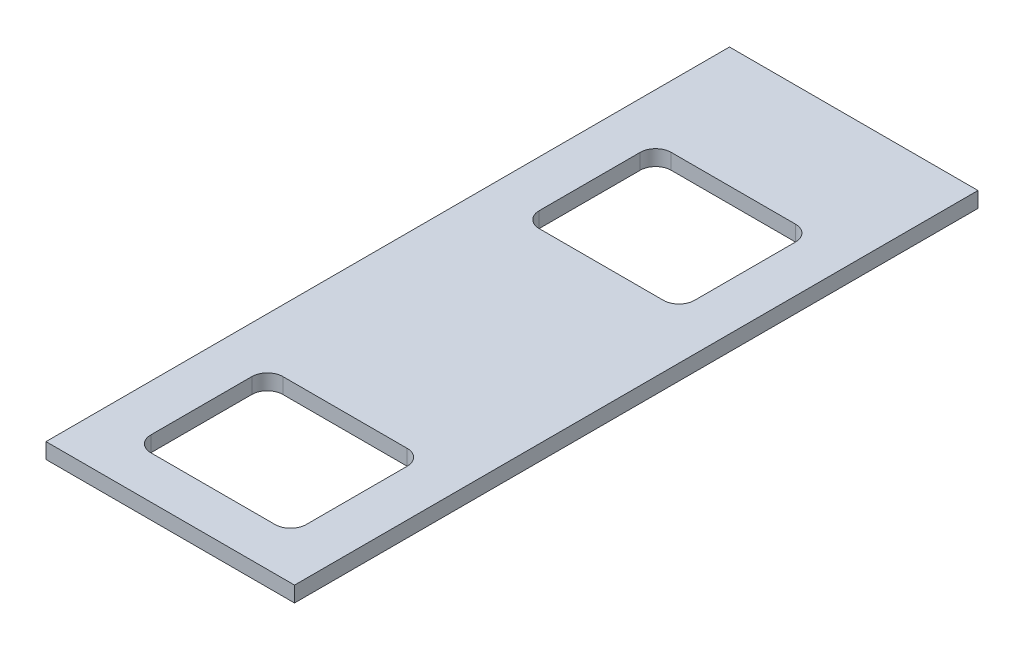
ISO-10303-21;
HEADER;
FILE_DESCRIPTION(('STEP AP214'),'2;1');
FILE_NAME('part.step','',(''),(''),'','','');
FILE_SCHEMA(('AUTOMOTIVE_DESIGN { 1 0 10303 214 1 1 1 1 }'));
ENDSEC;
DATA;
#1=APPLICATION_CONTEXT('core data for automotive mechanical design processes');
#2=APPLICATION_PROTOCOL_DEFINITION('international standard','automotive_design',2000,#1);
#3=PRODUCT_CONTEXT('',#1,'mechanical');
#4=PRODUCT('Part','Part','',(#3));
#5=PRODUCT_RELATED_PRODUCT_CATEGORY('part','',(#4));
#6=PRODUCT_DEFINITION_FORMATION('','',#4);
#7=PRODUCT_DEFINITION_CONTEXT('part definition',#1,'design');
#8=PRODUCT_DEFINITION('design','',#6,#7);
#9=PRODUCT_DEFINITION_SHAPE('','',#8);
#10=(LENGTH_UNIT() NAMED_UNIT(*) SI_UNIT(.MILLI.,.METRE.));
#11=(NAMED_UNIT(*) PLANE_ANGLE_UNIT() SI_UNIT($,.RADIAN.));
#12=(NAMED_UNIT(*) SI_UNIT($,.STERADIAN.) SOLID_ANGLE_UNIT());
#13=UNCERTAINTY_MEASURE_WITH_UNIT(LENGTH_MEASURE(1.E-05),#10,'distance_accuracy_value','');
#14=(GEOMETRIC_REPRESENTATION_CONTEXT(3) GLOBAL_UNCERTAINTY_ASSIGNED_CONTEXT((#13)) GLOBAL_UNIT_ASSIGNED_CONTEXT((#10,
#11,#12)) REPRESENTATION_CONTEXT('',''));
#15=CARTESIAN_POINT('',(0.,0.,0.));
#16=DIRECTION('',(0.,0.,1.));
#17=DIRECTION('',(1.,0.,0.));
#18=AXIS2_PLACEMENT_3D('',#15,#16,#17);
#19=CARTESIAN_POINT('',(-25.4,25.4,69.85));
#20=DIRECTION('',(0.,-1.,0.));
#21=DIRECTION('',(0.,0.,-1.));
#22=AXIS2_PLACEMENT_3D('',#19,#20,#21);
#23=PLANE('',#22);
#24=DIRECTION('',(0.,0.,-1.));
#25=VECTOR('',#24,1.);
#26=CARTESIAN_POINT('',(15.875,25.4,34.13125));
#27=LINE('',#26,#25);
#28=CARTESIAN_POINT('',(15.875,25.4,57.94375));
#29=VERTEX_POINT('',#28);
#30=CARTESIAN_POINT('',(15.875,25.4,37.30625));
#31=VERTEX_POINT('',#30);
#32=EDGE_CURVE('E366',#29,#31,#27,.T.);
#33=ORIENTED_EDGE('',*,*,#32,.F.);
#34=CARTESIAN_POINT('',(12.7,25.4,57.94375));
#35=DIRECTION('',(0.,-1.,0.));
#36=DIRECTION('',(0.,0.,-1.));
#37=AXIS2_PLACEMENT_3D('',#34,#35,#36);
#38=CIRCLE('',#37,3.175);
#39=CARTESIAN_POINT('',(12.7,25.4,61.11875));
#40=VERTEX_POINT('',#39);
#41=EDGE_CURVE('E351',#29,#40,#38,.T.);
#42=ORIENTED_EDGE('',*,*,#41,.T.);
#43=DIRECTION('',(1.,0.,0.));
#44=VECTOR('',#43,1.);
#45=CARTESIAN_POINT('',(15.875,25.4,61.11875));
#46=LINE('',#45,#44);
#47=CARTESIAN_POINT('',(-12.7,25.4,61.11875));
#48=VERTEX_POINT('',#47);
#49=EDGE_CURVE('E203',#48,#40,#46,.T.);
#50=ORIENTED_EDGE('',*,*,#49,.F.);
#51=CARTESIAN_POINT('',(-12.7,25.4,57.94375));
#52=DIRECTION('',(0.,-1.,0.));
#53=DIRECTION('',(0.,0.,-1.));
#54=AXIS2_PLACEMENT_3D('',#51,#52,#53);
#55=CIRCLE('',#54,3.175);
#56=CARTESIAN_POINT('',(-15.875,25.4,57.94375));
#57=VERTEX_POINT('',#56);
#58=EDGE_CURVE('E346',#48,#57,#55,.T.);
#59=ORIENTED_EDGE('',*,*,#58,.T.);
#60=DIRECTION('',(0.,0.,1.));
#61=VECTOR('',#60,1.);
#62=CARTESIAN_POINT('',(-15.875,25.4,34.13125));
#63=LINE('',#62,#61);
#64=CARTESIAN_POINT('',(-15.875,25.4,37.30625));
#65=VERTEX_POINT('',#64);
#66=EDGE_CURVE('E380',#65,#57,#63,.T.);
#67=ORIENTED_EDGE('',*,*,#66,.F.);
#68=CARTESIAN_POINT('',(-12.7,25.4,37.30625));
#69=DIRECTION('',(0.,-1.,0.));
#70=DIRECTION('',(0.,0.,-1.));
#71=AXIS2_PLACEMENT_3D('',#68,#69,#70);
#72=CIRCLE('',#71,3.175);
#73=CARTESIAN_POINT('',(-12.7,25.4,34.13125));
#74=VERTEX_POINT('',#73);
#75=EDGE_CURVE('E340',#65,#74,#72,.T.);
#76=ORIENTED_EDGE('',*,*,#75,.T.);
#77=DIRECTION('',(-1.,0.,0.));
#78=VECTOR('',#77,1.);
#79=CARTESIAN_POINT('',(15.875,25.4,34.13125));
#80=LINE('',#79,#78);
#81=CARTESIAN_POINT('',(12.7,25.4,34.13125));
#82=VERTEX_POINT('',#81);
#83=EDGE_CURVE('E368',#82,#74,#80,.T.);
#84=ORIENTED_EDGE('',*,*,#83,.F.);
#85=CARTESIAN_POINT('',(12.7,25.4,37.30625));
#86=DIRECTION('',(0.,-1.,0.));
#87=DIRECTION('',(0.,0.,-1.));
#88=AXIS2_PLACEMENT_3D('',#85,#86,#87);
#89=CIRCLE('',#88,3.175);
#90=EDGE_CURVE('E11',#82,#31,#89,.T.);
#91=ORIENTED_EDGE('',*,*,#90,.T.);
#92=EDGE_LOOP('',(#33,#42,#50,#59,#67,#76,#84,#91));
#93=FACE_BOUND('',#92,.T.);
#94=DIRECTION('',(-1.,0.,0.));
#95=VECTOR('',#94,1.);
#96=CARTESIAN_POINT('',(-25.4,25.4,-69.85));
#97=LINE('',#96,#95);
#98=CARTESIAN_POINT('',(25.4,25.4,-69.85));
#99=VERTEX_POINT('',#98);
#100=CARTESIAN_POINT('',(-25.4,25.4,-69.85));
#101=VERTEX_POINT('',#100);
#102=EDGE_CURVE('E212',#99,#101,#97,.T.);
#103=ORIENTED_EDGE('',*,*,#102,.T.);
#104=DIRECTION('',(0.,0.,-1.));
#105=VECTOR('',#104,1.);
#106=CARTESIAN_POINT('',(-25.4,25.4,69.85));
#107=LINE('',#106,#105);
#108=CARTESIAN_POINT('',(-25.4,25.4,69.85));
#109=VERTEX_POINT('',#108);
#110=EDGE_CURVE('E209',#109,#101,#107,.T.);
#111=ORIENTED_EDGE('',*,*,#110,.F.);
#112=DIRECTION('',(-1.,0.,0.));
#113=VECTOR('',#112,1.);
#114=CARTESIAN_POINT('',(-25.4,25.4,69.85));
#115=LINE('',#114,#113);
#116=CARTESIAN_POINT('',(25.4,25.4,69.85));
#117=VERTEX_POINT('',#116);
#118=EDGE_CURVE('E216',#117,#109,#115,.T.);
#119=ORIENTED_EDGE('',*,*,#118,.F.);
#120=DIRECTION('',(0.,0.,-1.));
#121=VECTOR('',#120,1.);
#122=CARTESIAN_POINT('',(25.4,25.4,69.85));
#123=LINE('',#122,#121);
#124=EDGE_CURVE('E223',#117,#99,#123,.T.);
#125=ORIENTED_EDGE('',*,*,#124,.T.);
#126=EDGE_LOOP('',(#103,#111,#119,#125));
#127=FACE_BOUND('',#126,.T.);
#128=DIRECTION('',(0.,0.,-1.));
#129=VECTOR('',#128,1.);
#130=CARTESIAN_POINT('',(15.875,25.4,-45.24375));
#131=LINE('',#130,#129);
#132=CARTESIAN_POINT('',(15.875,25.4,-21.43125));
#133=VERTEX_POINT('',#132);
#134=CARTESIAN_POINT('',(15.875,25.4,-42.06875));
#135=VERTEX_POINT('',#134);
#136=EDGE_CURVE('E373',#133,#135,#131,.T.);
#137=ORIENTED_EDGE('',*,*,#136,.F.);
#138=CARTESIAN_POINT('',(12.7,25.4,-21.43125));
#139=DIRECTION('',(0.,-1.,0.));
#140=DIRECTION('',(0.,0.,-1.));
#141=AXIS2_PLACEMENT_3D('',#138,#139,#140);
#142=CIRCLE('',#141,3.175);
#143=CARTESIAN_POINT('',(12.7,25.4,-18.25625));
#144=VERTEX_POINT('',#143);
#145=EDGE_CURVE('E307',#133,#144,#142,.T.);
#146=ORIENTED_EDGE('',*,*,#145,.T.);
#147=DIRECTION('',(1.,0.,0.));
#148=VECTOR('',#147,1.);
#149=CARTESIAN_POINT('',(15.875,25.4,-18.25625));
#150=LINE('',#149,#148);
#151=CARTESIAN_POINT('',(-12.7,25.4,-18.25625));
#152=VERTEX_POINT('',#151);
#153=EDGE_CURVE('E194',#152,#144,#150,.T.);
#154=ORIENTED_EDGE('',*,*,#153,.F.);
#155=CARTESIAN_POINT('',(-12.7,25.4,-21.43125));
#156=DIRECTION('',(0.,-1.,0.));
#157=DIRECTION('',(0.,0.,-1.));
#158=AXIS2_PLACEMENT_3D('',#155,#156,#157);
#159=CIRCLE('',#158,3.175);
#160=CARTESIAN_POINT('',(-15.875,25.4,-21.43125));
#161=VERTEX_POINT('',#160);
#162=EDGE_CURVE('E301',#152,#161,#159,.T.);
#163=ORIENTED_EDGE('',*,*,#162,.T.);
#164=DIRECTION('',(0.,0.,1.));
#165=VECTOR('',#164,1.);
#166=CARTESIAN_POINT('',(-15.875,25.4,-45.24375));
#167=LINE('',#166,#165);
#168=CARTESIAN_POINT('',(-15.875,25.4,-42.06875));
#169=VERTEX_POINT('',#168);
#170=EDGE_CURVE('E404',#169,#161,#167,.T.);
#171=ORIENTED_EDGE('',*,*,#170,.F.);
#172=CARTESIAN_POINT('',(-12.7,25.4,-42.06875));
#173=DIRECTION('',(0.,-1.,0.));
#174=DIRECTION('',(0.,0.,-1.));
#175=AXIS2_PLACEMENT_3D('',#172,#173,#174);
#176=CIRCLE('',#175,3.175);
#177=CARTESIAN_POINT('',(-12.7,25.4,-45.24375));
#178=VERTEX_POINT('',#177);
#179=EDGE_CURVE('E295',#169,#178,#176,.T.);
#180=ORIENTED_EDGE('',*,*,#179,.T.);
#181=DIRECTION('',(-1.,0.,0.));
#182=VECTOR('',#181,1.);
#183=CARTESIAN_POINT('',(15.875,25.4,-45.24375));
#184=LINE('',#183,#182);
#185=CARTESIAN_POINT('',(12.7,25.4,-45.24375));
#186=VERTEX_POINT('',#185);
#187=EDGE_CURVE('E378',#186,#178,#184,.T.);
#188=ORIENTED_EDGE('',*,*,#187,.F.);
#189=CARTESIAN_POINT('',(12.7,25.4,-42.06875));
#190=DIRECTION('',(0.,-1.,0.));
#191=DIRECTION('',(0.,0.,-1.));
#192=AXIS2_PLACEMENT_3D('',#189,#190,#191);
#193=CIRCLE('',#192,3.175);
#194=EDGE_CURVE('E289',#186,#135,#193,.T.);
#195=ORIENTED_EDGE('',*,*,#194,.T.);
#196=EDGE_LOOP('',(#137,#146,#154,#163,#171,#180,#188,#195));
#197=FACE_BOUND('',#196,.T.);
#198=ADVANCED_FACE('F44',(#93,#127,#197),#23,.F.);
#199=CARTESIAN_POINT('',(-25.4,22.225,69.85));
#200=DIRECTION('',(0.,-1.,0.));
#201=DIRECTION('',(0.,0.,-1.));
#202=AXIS2_PLACEMENT_3D('',#199,#200,#201);
#203=PLANE('',#202);
#204=DIRECTION('',(-1.,0.,0.));
#205=VECTOR('',#204,1.);
#206=CARTESIAN_POINT('',(0.,22.225,-69.85));
#207=LINE('',#206,#205);
#208=CARTESIAN_POINT('',(25.4,22.225,-69.85));
#209=VERTEX_POINT('',#208);
#210=CARTESIAN_POINT('',(-25.4,22.225,-69.85));
#211=VERTEX_POINT('',#210);
#212=EDGE_CURVE('E182',#209,#211,#207,.T.);
#213=ORIENTED_EDGE('',*,*,#212,.F.);
#214=DIRECTION('',(0.,0.,1.));
#215=VECTOR('',#214,1.);
#216=CARTESIAN_POINT('',(25.4,22.225,69.85));
#217=LINE('',#216,#215);
#218=CARTESIAN_POINT('',(25.4,22.225,69.85));
#219=VERTEX_POINT('',#218);
#220=EDGE_CURVE('E204',#209,#219,#217,.T.);
#221=ORIENTED_EDGE('',*,*,#220,.T.);
#222=DIRECTION('',(-1.,0.,0.));
#223=VECTOR('',#222,1.);
#224=CARTESIAN_POINT('',(0.,22.225,69.85));
#225=LINE('',#224,#223);
#226=CARTESIAN_POINT('',(-25.4,22.225,69.85));
#227=VERTEX_POINT('',#226);
#228=EDGE_CURVE('E193',#219,#227,#225,.T.);
#229=ORIENTED_EDGE('',*,*,#228,.T.);
#230=DIRECTION('',(0.,0.,1.));
#231=VECTOR('',#230,1.);
#232=CARTESIAN_POINT('',(-25.4,22.225,69.85));
#233=LINE('',#232,#231);
#234=EDGE_CURVE('E197',#211,#227,#233,.T.);
#235=ORIENTED_EDGE('',*,*,#234,.F.);
#236=EDGE_LOOP('',(#213,#221,#229,#235));
#237=FACE_BOUND('',#236,.T.);
#238=DIRECTION('',(0.,0.,1.));
#239=VECTOR('',#238,1.);
#240=CARTESIAN_POINT('',(-15.875,22.225,69.85));
#241=LINE('',#240,#239);
#242=CARTESIAN_POINT('',(-15.875,22.225,37.30625));
#243=VERTEX_POINT('',#242);
#244=CARTESIAN_POINT('',(-15.875,22.225,57.94375));
#245=VERTEX_POINT('',#244);
#246=EDGE_CURVE('E231',#243,#245,#241,.T.);
#247=ORIENTED_EDGE('',*,*,#246,.T.);
#248=CARTESIAN_POINT('',(-12.7,22.225,57.94375));
#249=DIRECTION('',(0.,-1.,0.));
#250=DIRECTION('',(0.,0.,-1.));
#251=AXIS2_PLACEMENT_3D('',#248,#249,#250);
#252=CIRCLE('',#251,3.175);
#253=CARTESIAN_POINT('',(-12.7,22.225,61.11875));
#254=VERTEX_POINT('',#253);
#255=EDGE_CURVE('E343',#245,#254,#252,.F.);
#256=ORIENTED_EDGE('',*,*,#255,.T.);
#257=DIRECTION('',(1.,0.,0.));
#258=VECTOR('',#257,1.);
#259=CARTESIAN_POINT('',(-25.4,22.225,61.11875));
#260=LINE('',#259,#258);
#261=CARTESIAN_POINT('',(12.7,22.225,61.11875));
#262=VERTEX_POINT('',#261);
#263=EDGE_CURVE('E228',#254,#262,#260,.T.);
#264=ORIENTED_EDGE('',*,*,#263,.T.);
#265=CARTESIAN_POINT('',(12.7,22.225,57.94375));
#266=DIRECTION('',(0.,-1.,0.));
#267=DIRECTION('',(0.,0.,-1.));
#268=AXIS2_PLACEMENT_3D('',#265,#266,#267);
#269=CIRCLE('',#268,3.175);
#270=CARTESIAN_POINT('',(15.875,22.225,57.94375));
#271=VERTEX_POINT('',#270);
#272=EDGE_CURVE('E67',#262,#271,#269,.F.);
#273=ORIENTED_EDGE('',*,*,#272,.T.);
#274=DIRECTION('',(0.,0.,-1.));
#275=VECTOR('',#274,1.);
#276=CARTESIAN_POINT('',(15.875,22.225,69.85));
#277=LINE('',#276,#275);
#278=CARTESIAN_POINT('',(15.875,22.225,37.30625));
#279=VERTEX_POINT('',#278);
#280=EDGE_CURVE('E239',#271,#279,#277,.T.);
#281=ORIENTED_EDGE('',*,*,#280,.T.);
#282=CARTESIAN_POINT('',(12.7,22.225,37.30625));
#283=DIRECTION('',(0.,-1.,0.));
#284=DIRECTION('',(0.,0.,-1.));
#285=AXIS2_PLACEMENT_3D('',#282,#283,#284);
#286=CIRCLE('',#285,3.175);
#287=CARTESIAN_POINT('',(12.7,22.225,34.13125));
#288=VERTEX_POINT('',#287);
#289=EDGE_CURVE('E53',#279,#288,#286,.F.);
#290=ORIENTED_EDGE('',*,*,#289,.T.);
#291=DIRECTION('',(-1.,0.,0.));
#292=VECTOR('',#291,1.);
#293=CARTESIAN_POINT('',(-25.4,22.225,34.13125));
#294=LINE('',#293,#292);
#295=CARTESIAN_POINT('',(-12.7,22.225,34.13125));
#296=VERTEX_POINT('',#295);
#297=EDGE_CURVE('E235',#288,#296,#294,.T.);
#298=ORIENTED_EDGE('',*,*,#297,.T.);
#299=CARTESIAN_POINT('',(-12.7,22.225,37.30625));
#300=DIRECTION('',(0.,-1.,0.));
#301=DIRECTION('',(0.,0.,-1.));
#302=AXIS2_PLACEMENT_3D('',#299,#300,#301);
#303=CIRCLE('',#302,3.175);
#304=EDGE_CURVE('E337',#296,#243,#303,.F.);
#305=ORIENTED_EDGE('',*,*,#304,.T.);
#306=EDGE_LOOP('',(#247,#256,#264,#273,#281,#290,#298,#305));
#307=FACE_BOUND('',#306,.T.);
#308=DIRECTION('',(0.,0.,1.));
#309=VECTOR('',#308,1.);
#310=CARTESIAN_POINT('',(-15.875,22.225,69.85));
#311=LINE('',#310,#309);
#312=CARTESIAN_POINT('',(-15.875,22.225,-42.06875));
#313=VERTEX_POINT('',#312);
#314=CARTESIAN_POINT('',(-15.875,22.225,-21.43125));
#315=VERTEX_POINT('',#314);
#316=EDGE_CURVE('E246',#313,#315,#311,.T.);
#317=ORIENTED_EDGE('',*,*,#316,.T.);
#318=CARTESIAN_POINT('',(-12.7,22.225,-21.43125));
#319=DIRECTION('',(0.,-1.,0.));
#320=DIRECTION('',(0.,0.,-1.));
#321=AXIS2_PLACEMENT_3D('',#318,#319,#320);
#322=CIRCLE('',#321,3.175);
#323=CARTESIAN_POINT('',(-12.7,22.225,-18.25625));
#324=VERTEX_POINT('',#323);
#325=EDGE_CURVE('E298',#315,#324,#322,.F.);
#326=ORIENTED_EDGE('',*,*,#325,.T.);
#327=DIRECTION('',(1.,0.,0.));
#328=VECTOR('',#327,1.);
#329=CARTESIAN_POINT('',(-25.3999999999999,22.225,-18.25625));
#330=LINE('',#329,#328);
#331=CARTESIAN_POINT('',(12.7,22.225,-18.25625));
#332=VERTEX_POINT('',#331);
#333=EDGE_CURVE('E242',#324,#332,#330,.T.);
#334=ORIENTED_EDGE('',*,*,#333,.T.);
#335=CARTESIAN_POINT('',(12.7,22.225,-21.43125));
#336=DIRECTION('',(0.,-1.,0.));
#337=DIRECTION('',(0.,0.,-1.));
#338=AXIS2_PLACEMENT_3D('',#335,#336,#337);
#339=CIRCLE('',#338,3.175);
#340=CARTESIAN_POINT('',(15.875,22.225,-21.43125));
#341=VERTEX_POINT('',#340);
#342=EDGE_CURVE('E304',#332,#341,#339,.F.);
#343=ORIENTED_EDGE('',*,*,#342,.T.);
#344=DIRECTION('',(0.,0.,-1.));
#345=VECTOR('',#344,1.);
#346=CARTESIAN_POINT('',(15.875,22.225,69.85));
#347=LINE('',#346,#345);
#348=CARTESIAN_POINT('',(15.875,22.225,-42.06875));
#349=VERTEX_POINT('',#348);
#350=EDGE_CURVE('E254',#341,#349,#347,.T.);
#351=ORIENTED_EDGE('',*,*,#350,.T.);
#352=CARTESIAN_POINT('',(12.7,22.225,-42.06875));
#353=DIRECTION('',(0.,-1.,0.));
#354=DIRECTION('',(0.,0.,-1.));
#355=AXIS2_PLACEMENT_3D('',#352,#353,#354);
#356=CIRCLE('',#355,3.175);
#357=CARTESIAN_POINT('',(12.7,22.225,-45.24375));
#358=VERTEX_POINT('',#357);
#359=EDGE_CURVE('E286',#349,#358,#356,.F.);
#360=ORIENTED_EDGE('',*,*,#359,.T.);
#361=DIRECTION('',(-1.,0.,0.));
#362=VECTOR('',#361,1.);
#363=CARTESIAN_POINT('',(-25.4,22.225,-45.24375));
#364=LINE('',#363,#362);
#365=CARTESIAN_POINT('',(-12.7,22.225,-45.24375));
#366=VERTEX_POINT('',#365);
#367=EDGE_CURVE('E250',#358,#366,#364,.T.);
#368=ORIENTED_EDGE('',*,*,#367,.T.);
#369=CARTESIAN_POINT('',(-12.7,22.225,-42.06875));
#370=DIRECTION('',(0.,-1.,0.));
#371=DIRECTION('',(0.,0.,-1.));
#372=AXIS2_PLACEMENT_3D('',#369,#370,#371);
#373=CIRCLE('',#372,3.175);
#374=EDGE_CURVE('E292',#366,#313,#373,.F.);
#375=ORIENTED_EDGE('',*,*,#374,.T.);
#376=EDGE_LOOP('',(#317,#326,#334,#343,#351,#360,#368,#375));
#377=FACE_BOUND('',#376,.T.);
#378=ADVANCED_FACE('F198',(#237,#307,#377),#203,.T.);
#379=CARTESIAN_POINT('',(0.,0.,69.85));
#380=DIRECTION('',(0.,0.,-1.));
#381=DIRECTION('',(-1.,0.,0.));
#382=AXIS2_PLACEMENT_3D('',#379,#380,#381);
#383=PLANE('',#382);
#384=DIRECTION('',(0.,-1.,0.));
#385=VECTOR('',#384,1.);
#386=CARTESIAN_POINT('',(-25.4,-25.4,69.85));
#387=LINE('',#386,#385);
#388=EDGE_CURVE('E224',#109,#227,#387,.T.);
#389=ORIENTED_EDGE('',*,*,#388,.T.);
#390=ORIENTED_EDGE('',*,*,#228,.F.);
#391=DIRECTION('',(0.,1.,0.));
#392=VECTOR('',#391,1.);
#393=CARTESIAN_POINT('',(25.4,-25.4,69.85));
#394=LINE('',#393,#392);
#395=EDGE_CURVE('E211',#219,#117,#394,.T.);
#396=ORIENTED_EDGE('',*,*,#395,.T.);
#397=ORIENTED_EDGE('',*,*,#118,.T.);
#398=EDGE_LOOP('',(#389,#390,#396,#397));
#399=FACE_BOUND('',#398,.T.);
#400=ADVANCED_FACE('F397',(#399),#383,.F.);
#401=CARTESIAN_POINT('',(0.,0.,-69.85));
#402=DIRECTION('',(0.,0.,-1.));
#403=DIRECTION('',(-1.,0.,0.));
#404=AXIS2_PLACEMENT_3D('',#401,#402,#403);
#405=PLANE('',#404);
#406=ORIENTED_EDGE('',*,*,#212,.T.);
#407=DIRECTION('',(0.,-1.,0.));
#408=VECTOR('',#407,1.);
#409=CARTESIAN_POINT('',(-25.4,-25.4,-69.85));
#410=LINE('',#409,#408);
#411=EDGE_CURVE('E187',#101,#211,#410,.T.);
#412=ORIENTED_EDGE('',*,*,#411,.F.);
#413=ORIENTED_EDGE('',*,*,#102,.F.);
#414=DIRECTION('',(0.,1.,0.));
#415=VECTOR('',#414,1.);
#416=CARTESIAN_POINT('',(25.4,-25.4,-69.85));
#417=LINE('',#416,#415);
#418=EDGE_CURVE('E188',#209,#99,#417,.T.);
#419=ORIENTED_EDGE('',*,*,#418,.F.);
#420=EDGE_LOOP('',(#406,#412,#413,#419));
#421=FACE_BOUND('',#420,.T.);
#422=ADVANCED_FACE('F184',(#421),#405,.T.);
#423=CARTESIAN_POINT('',(25.4,-25.4,69.85));
#424=DIRECTION('',(-1.,0.,0.));
#425=DIRECTION('',(0.,0.,1.));
#426=AXIS2_PLACEMENT_3D('',#423,#424,#425);
#427=PLANE('',#426);
#428=ORIENTED_EDGE('',*,*,#395,.F.);
#429=ORIENTED_EDGE('',*,*,#220,.F.);
#430=ORIENTED_EDGE('',*,*,#418,.T.);
#431=ORIENTED_EDGE('',*,*,#124,.F.);
#432=EDGE_LOOP('',(#428,#429,#430,#431));
#433=FACE_BOUND('',#432,.T.);
#434=ADVANCED_FACE('F393',(#433),#427,.F.);
#435=CARTESIAN_POINT('',(-25.4,-25.4,69.85));
#436=DIRECTION('',(1.,0.,0.));
#437=DIRECTION('',(0.,0.,-1.));
#438=AXIS2_PLACEMENT_3D('',#435,#436,#437);
#439=PLANE('',#438);
#440=ORIENTED_EDGE('',*,*,#411,.T.);
#441=ORIENTED_EDGE('',*,*,#234,.T.);
#442=ORIENTED_EDGE('',*,*,#388,.F.);
#443=ORIENTED_EDGE('',*,*,#110,.T.);
#444=EDGE_LOOP('',(#440,#441,#442,#443));
#445=FACE_BOUND('',#444,.T.);
#446=ADVANCED_FACE('F207',(#445),#439,.F.);
#447=CARTESIAN_POINT('',(15.875,25.4,34.13125));
#448=DIRECTION('',(-1.,0.,0.));
#449=DIRECTION('',(0.,0.,1.));
#450=AXIS2_PLACEMENT_3D('',#447,#448,#449);
#451=PLANE('',#450);
#452=ORIENTED_EDGE('',*,*,#280,.F.);
#453=DIRECTION('',(0.,-1.,0.));
#454=VECTOR('',#453,1.);
#455=CARTESIAN_POINT('',(15.875,25.4,57.94375));
#456=LINE('',#455,#454);
#457=EDGE_CURVE('E334',#271,#29,#456,.F.);
#458=ORIENTED_EDGE('',*,*,#457,.T.);
#459=ORIENTED_EDGE('',*,*,#32,.T.);
#460=DIRECTION('',(0.,-1.,0.));
#461=VECTOR('',#460,1.);
#462=CARTESIAN_POINT('',(15.875,22.225,37.30625));
#463=LINE('',#462,#461);
#464=EDGE_CURVE('E331',#31,#279,#463,.T.);
#465=ORIENTED_EDGE('',*,*,#464,.T.);
#466=EDGE_LOOP('',(#452,#458,#459,#465));
#467=FACE_BOUND('',#466,.T.);
#468=ADVANCED_FACE('F370',(#467),#451,.T.);
#469=CARTESIAN_POINT('',(15.875,25.4,34.13125));
#470=DIRECTION('',(0.,0.,1.));
#471=DIRECTION('',(1.,0.,0.));
#472=AXIS2_PLACEMENT_3D('',#469,#470,#471);
#473=PLANE('',#472);
#474=ORIENTED_EDGE('',*,*,#83,.T.);
#475=DIRECTION('',(0.,-1.,0.));
#476=VECTOR('',#475,1.);
#477=CARTESIAN_POINT('',(-12.7,22.225,34.13125));
#478=LINE('',#477,#476);
#479=EDGE_CURVE('E313',#74,#296,#478,.T.);
#480=ORIENTED_EDGE('',*,*,#479,.T.);
#481=ORIENTED_EDGE('',*,*,#297,.F.);
#482=DIRECTION('',(0.,-1.,0.));
#483=VECTOR('',#482,1.);
#484=CARTESIAN_POINT('',(12.7,25.4,34.13125));
#485=LINE('',#484,#483);
#486=EDGE_CURVE('E310',#288,#82,#485,.F.);
#487=ORIENTED_EDGE('',*,*,#486,.T.);
#488=EDGE_LOOP('',(#474,#480,#481,#487));
#489=FACE_BOUND('',#488,.T.);
#490=ADVANCED_FACE('F358',(#489),#473,.T.);
#491=CARTESIAN_POINT('',(-15.875,25.4,34.13125));
#492=DIRECTION('',(1.,0.,0.));
#493=DIRECTION('',(0.,0.,-1.));
#494=AXIS2_PLACEMENT_3D('',#491,#492,#493);
#495=PLANE('',#494);
#496=ORIENTED_EDGE('',*,*,#246,.F.);
#497=DIRECTION('',(0.,-1.,0.));
#498=VECTOR('',#497,1.);
#499=CARTESIAN_POINT('',(-15.875,25.4,37.30625));
#500=LINE('',#499,#498);
#501=EDGE_CURVE('E321',#243,#65,#500,.F.);
#502=ORIENTED_EDGE('',*,*,#501,.T.);
#503=ORIENTED_EDGE('',*,*,#66,.T.);
#504=DIRECTION('',(0.,-1.,0.));
#505=VECTOR('',#504,1.);
#506=CARTESIAN_POINT('',(-15.875,22.225,57.94375));
#507=LINE('',#506,#505);
#508=EDGE_CURVE('E317',#57,#245,#507,.T.);
#509=ORIENTED_EDGE('',*,*,#508,.T.);
#510=EDGE_LOOP('',(#496,#502,#503,#509));
#511=FACE_BOUND('',#510,.T.);
#512=ADVANCED_FACE('F419',(#511),#495,.T.);
#513=CARTESIAN_POINT('',(15.875,25.4,61.11875));
#514=DIRECTION('',(0.,0.,-1.));
#515=DIRECTION('',(-1.,0.,0.));
#516=AXIS2_PLACEMENT_3D('',#513,#514,#515);
#517=PLANE('',#516);
#518=ORIENTED_EDGE('',*,*,#263,.F.);
#519=DIRECTION('',(0.,-1.,0.));
#520=VECTOR('',#519,1.);
#521=CARTESIAN_POINT('',(-12.7,25.4,61.11875));
#522=LINE('',#521,#520);
#523=EDGE_CURVE('E328',#254,#48,#522,.F.);
#524=ORIENTED_EDGE('',*,*,#523,.T.);
#525=ORIENTED_EDGE('',*,*,#49,.T.);
#526=DIRECTION('',(0.,-1.,0.));
#527=VECTOR('',#526,1.);
#528=CARTESIAN_POINT('',(12.7,22.225,61.11875));
#529=LINE('',#528,#527);
#530=EDGE_CURVE('E324',#40,#262,#529,.T.);
#531=ORIENTED_EDGE('',*,*,#530,.T.);
#532=EDGE_LOOP('',(#518,#524,#525,#531));
#533=FACE_BOUND('',#532,.T.);
#534=ADVANCED_FACE('F428',(#533),#517,.T.);
#535=CARTESIAN_POINT('',(15.875,25.4,-45.24375));
#536=DIRECTION('',(-1.,0.,0.));
#537=DIRECTION('',(0.,0.,1.));
#538=AXIS2_PLACEMENT_3D('',#535,#536,#537);
#539=PLANE('',#538);
#540=ORIENTED_EDGE('',*,*,#136,.T.);
#541=DIRECTION('',(0.,-1.,0.));
#542=VECTOR('',#541,1.);
#543=CARTESIAN_POINT('',(15.875,22.225,-42.06875));
#544=LINE('',#543,#542);
#545=EDGE_CURVE('E261',#135,#349,#544,.T.);
#546=ORIENTED_EDGE('',*,*,#545,.T.);
#547=ORIENTED_EDGE('',*,*,#350,.F.);
#548=DIRECTION('',(0.,-1.,0.));
#549=VECTOR('',#548,1.);
#550=CARTESIAN_POINT('',(15.875,25.4,-21.43125));
#551=LINE('',#550,#549);
#552=EDGE_CURVE('E258',#341,#133,#551,.F.);
#553=ORIENTED_EDGE('',*,*,#552,.T.);
#554=EDGE_LOOP('',(#540,#546,#547,#553));
#555=FACE_BOUND('',#554,.T.);
#556=ADVANCED_FACE('F539',(#555),#539,.T.);
#557=CARTESIAN_POINT('',(15.875,25.4,-45.24375));
#558=DIRECTION('',(0.,0.,1.));
#559=DIRECTION('',(1.,0.,0.));
#560=AXIS2_PLACEMENT_3D('',#557,#558,#559);
#561=PLANE('',#560);
#562=ORIENTED_EDGE('',*,*,#367,.F.);
#563=DIRECTION('',(0.,-1.,0.));
#564=VECTOR('',#563,1.);
#565=CARTESIAN_POINT('',(12.7,25.4,-45.24375));
#566=LINE('',#565,#564);
#567=EDGE_CURVE('E269',#358,#186,#566,.F.);
#568=ORIENTED_EDGE('',*,*,#567,.T.);
#569=ORIENTED_EDGE('',*,*,#187,.T.);
#570=DIRECTION('',(0.,-1.,0.));
#571=VECTOR('',#570,1.);
#572=CARTESIAN_POINT('',(-12.7,22.225,-45.24375));
#573=LINE('',#572,#571);
#574=EDGE_CURVE('E265',#178,#366,#573,.T.);
#575=ORIENTED_EDGE('',*,*,#574,.T.);
#576=EDGE_LOOP('',(#562,#568,#569,#575));
#577=FACE_BOUND('',#576,.T.);
#578=ADVANCED_FACE('F544',(#577),#561,.T.);
#579=CARTESIAN_POINT('',(-15.875,25.4,-45.24375));
#580=DIRECTION('',(1.,0.,0.));
#581=DIRECTION('',(0.,0.,-1.));
#582=AXIS2_PLACEMENT_3D('',#579,#580,#581);
#583=PLANE('',#582);
#584=ORIENTED_EDGE('',*,*,#316,.F.);
#585=DIRECTION('',(0.,-1.,0.));
#586=VECTOR('',#585,1.);
#587=CARTESIAN_POINT('',(-15.875,25.4,-42.06875));
#588=LINE('',#587,#586);
#589=EDGE_CURVE('E276',#313,#169,#588,.F.);
#590=ORIENTED_EDGE('',*,*,#589,.T.);
#591=ORIENTED_EDGE('',*,*,#170,.T.);
#592=DIRECTION('',(0.,-1.,0.));
#593=VECTOR('',#592,1.);
#594=CARTESIAN_POINT('',(-15.875,22.225,-21.43125));
#595=LINE('',#594,#593);
#596=EDGE_CURVE('E272',#161,#315,#595,.T.);
#597=ORIENTED_EDGE('',*,*,#596,.T.);
#598=EDGE_LOOP('',(#584,#590,#591,#597));
#599=FACE_BOUND('',#598,.T.);
#600=ADVANCED_FACE('F549',(#599),#583,.T.);
#601=CARTESIAN_POINT('',(15.875,25.4,-18.25625));
#602=DIRECTION('',(0.,0.,-1.));
#603=DIRECTION('',(-1.,0.,0.));
#604=AXIS2_PLACEMENT_3D('',#601,#602,#603);
#605=PLANE('',#604);
#606=ORIENTED_EDGE('',*,*,#333,.F.);
#607=DIRECTION('',(0.,-1.,0.));
#608=VECTOR('',#607,1.);
#609=CARTESIAN_POINT('',(-12.7,25.4,-18.25625));
#610=LINE('',#609,#608);
#611=EDGE_CURVE('E283',#324,#152,#610,.F.);
#612=ORIENTED_EDGE('',*,*,#611,.T.);
#613=ORIENTED_EDGE('',*,*,#153,.T.);
#614=DIRECTION('',(0.,-1.,0.));
#615=VECTOR('',#614,1.);
#616=CARTESIAN_POINT('',(12.7,22.225,-18.25625));
#617=LINE('',#616,#615);
#618=EDGE_CURVE('E279',#144,#332,#617,.T.);
#619=ORIENTED_EDGE('',*,*,#618,.T.);
#620=EDGE_LOOP('',(#606,#612,#613,#619));
#621=FACE_BOUND('',#620,.T.);
#622=ADVANCED_FACE('F457',(#621),#605,.T.);
#623=CARTESIAN_POINT('',(12.7,25.4,-42.06875));
#624=DIRECTION('',(0.,1.,0.));
#625=DIRECTION('',(0.,0.,1.));
#626=AXIS2_PLACEMENT_3D('',#623,#624,#625);
#627=CYLINDRICAL_SURFACE('',#626,3.175);
#628=ORIENTED_EDGE('',*,*,#194,.F.);
#629=ORIENTED_EDGE('',*,*,#567,.F.);
#630=ORIENTED_EDGE('',*,*,#359,.F.);
#631=ORIENTED_EDGE('',*,*,#545,.F.);
#632=EDGE_LOOP('',(#628,#629,#630,#631));
#633=FACE_BOUND('',#632,.T.);
#634=ADVANCED_FACE('F453',(#633),#627,.F.);
#635=CARTESIAN_POINT('',(-12.7,25.4,-42.06875));
#636=DIRECTION('',(0.,1.,0.));
#637=DIRECTION('',(0.,0.,1.));
#638=AXIS2_PLACEMENT_3D('',#635,#636,#637);
#639=CYLINDRICAL_SURFACE('',#638,3.175);
#640=ORIENTED_EDGE('',*,*,#179,.F.);
#641=ORIENTED_EDGE('',*,*,#589,.F.);
#642=ORIENTED_EDGE('',*,*,#374,.F.);
#643=ORIENTED_EDGE('',*,*,#574,.F.);
#644=EDGE_LOOP('',(#640,#641,#642,#643));
#645=FACE_BOUND('',#644,.T.);
#646=ADVANCED_FACE('F456',(#645),#639,.F.);
#647=CARTESIAN_POINT('',(-12.7,25.4,-21.43125));
#648=DIRECTION('',(0.,1.,0.));
#649=DIRECTION('',(0.,0.,1.));
#650=AXIS2_PLACEMENT_3D('',#647,#648,#649);
#651=CYLINDRICAL_SURFACE('',#650,3.175);
#652=ORIENTED_EDGE('',*,*,#162,.F.);
#653=ORIENTED_EDGE('',*,*,#611,.F.);
#654=ORIENTED_EDGE('',*,*,#325,.F.);
#655=ORIENTED_EDGE('',*,*,#596,.F.);
#656=EDGE_LOOP('',(#652,#653,#654,#655));
#657=FACE_BOUND('',#656,.T.);
#658=ADVANCED_FACE('F461',(#657),#651,.F.);
#659=CARTESIAN_POINT('',(12.7,25.4,-21.43125));
#660=DIRECTION('',(0.,1.,0.));
#661=DIRECTION('',(0.,0.,1.));
#662=AXIS2_PLACEMENT_3D('',#659,#660,#661);
#663=CYLINDRICAL_SURFACE('',#662,3.175);
#664=ORIENTED_EDGE('',*,*,#145,.F.);
#665=ORIENTED_EDGE('',*,*,#552,.F.);
#666=ORIENTED_EDGE('',*,*,#342,.F.);
#667=ORIENTED_EDGE('',*,*,#618,.F.);
#668=EDGE_LOOP('',(#664,#665,#666,#667));
#669=FACE_BOUND('',#668,.T.);
#670=ADVANCED_FACE('F465',(#669),#663,.F.);
#671=CARTESIAN_POINT('',(-12.7,25.4,37.30625));
#672=DIRECTION('',(0.,1.,0.));
#673=DIRECTION('',(0.,0.,1.));
#674=AXIS2_PLACEMENT_3D('',#671,#672,#673);
#675=CYLINDRICAL_SURFACE('',#674,3.175);
#676=ORIENTED_EDGE('',*,*,#75,.F.);
#677=ORIENTED_EDGE('',*,*,#501,.F.);
#678=ORIENTED_EDGE('',*,*,#304,.F.);
#679=ORIENTED_EDGE('',*,*,#479,.F.);
#680=EDGE_LOOP('',(#676,#677,#678,#679));
#681=FACE_BOUND('',#680,.T.);
#682=ADVANCED_FACE('F438',(#681),#675,.F.);
#683=CARTESIAN_POINT('',(-12.7,25.4,57.94375));
#684=DIRECTION('',(0.,1.,0.));
#685=DIRECTION('',(0.,0.,1.));
#686=AXIS2_PLACEMENT_3D('',#683,#684,#685);
#687=CYLINDRICAL_SURFACE('',#686,3.175);
#688=ORIENTED_EDGE('',*,*,#58,.F.);
#689=ORIENTED_EDGE('',*,*,#523,.F.);
#690=ORIENTED_EDGE('',*,*,#255,.F.);
#691=ORIENTED_EDGE('',*,*,#508,.F.);
#692=EDGE_LOOP('',(#688,#689,#690,#691));
#693=FACE_BOUND('',#692,.T.);
#694=ADVANCED_FACE('F424',(#693),#687,.F.);
#695=CARTESIAN_POINT('',(12.7,25.4,57.94375));
#696=DIRECTION('',(0.,1.,0.));
#697=DIRECTION('',(0.,0.,1.));
#698=AXIS2_PLACEMENT_3D('',#695,#696,#697);
#699=CYLINDRICAL_SURFACE('',#698,3.175);
#700=ORIENTED_EDGE('',*,*,#41,.F.);
#701=ORIENTED_EDGE('',*,*,#457,.F.);
#702=ORIENTED_EDGE('',*,*,#272,.F.);
#703=ORIENTED_EDGE('',*,*,#530,.F.);
#704=EDGE_LOOP('',(#700,#701,#702,#703));
#705=FACE_BOUND('',#704,.T.);
#706=ADVANCED_FACE('F432',(#705),#699,.F.);
#707=CARTESIAN_POINT('',(12.7,25.4,37.30625));
#708=DIRECTION('',(0.,1.,0.));
#709=DIRECTION('',(0.,0.,1.));
#710=AXIS2_PLACEMENT_3D('',#707,#708,#709);
#711=CYLINDRICAL_SURFACE('',#710,3.175);
#712=ORIENTED_EDGE('',*,*,#90,.F.);
#713=ORIENTED_EDGE('',*,*,#486,.F.);
#714=ORIENTED_EDGE('',*,*,#289,.F.);
#715=ORIENTED_EDGE('',*,*,#464,.F.);
#716=EDGE_LOOP('',(#712,#713,#714,#715));
#717=FACE_BOUND('',#716,.T.);
#718=ADVANCED_FACE('F46',(#717),#711,.F.);
#719=CLOSED_SHELL('',(#198,#378,#400,#422,#434,#446,#468,#490,#512,#534,#556,#578,#600,#622,
#634,#646,#658,#670,#682,#694,#706,#718));
#720=MANIFOLD_SOLID_BREP('B2',#719);
#721=ADVANCED_BREP_SHAPE_REPRESENTATION('',(#18,#720),#14);
#722=SHAPE_DEFINITION_REPRESENTATION(#9,#721);
ENDSEC;
END-ISO-10303-21;
